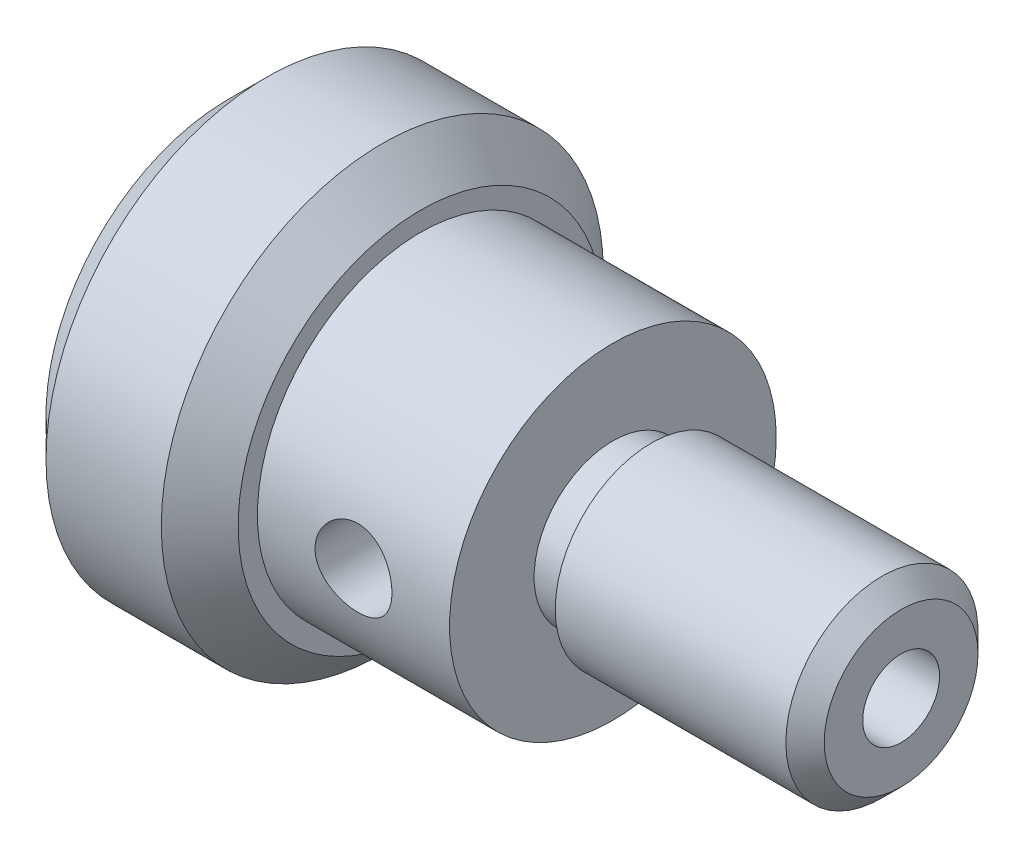
ISO-10303-21;
HEADER;
FILE_DESCRIPTION(('STEP AP214'),'2;1');
FILE_NAME('part.step','',(''),(''),'','','');
FILE_SCHEMA(('AUTOMOTIVE_DESIGN { 1 0 10303 214 1 1 1 1 }'));
ENDSEC;
DATA;
#1=APPLICATION_CONTEXT('core data for automotive mechanical design processes');
#2=APPLICATION_PROTOCOL_DEFINITION('international standard','automotive_design',2000,#1);
#3=PRODUCT_CONTEXT('',#1,'mechanical');
#4=PRODUCT('Part','Part','',(#3));
#5=PRODUCT_RELATED_PRODUCT_CATEGORY('part','',(#4));
#6=PRODUCT_DEFINITION_FORMATION('','',#4);
#7=PRODUCT_DEFINITION_CONTEXT('part definition',#1,'design');
#8=PRODUCT_DEFINITION('design','',#6,#7);
#9=PRODUCT_DEFINITION_SHAPE('','',#8);
#10=(LENGTH_UNIT() NAMED_UNIT(*) SI_UNIT(.MILLI.,.METRE.));
#11=(NAMED_UNIT(*) PLANE_ANGLE_UNIT() SI_UNIT($,.RADIAN.));
#12=(NAMED_UNIT(*) SI_UNIT($,.STERADIAN.) SOLID_ANGLE_UNIT());
#13=UNCERTAINTY_MEASURE_WITH_UNIT(LENGTH_MEASURE(1.E-05),#10,'distance_accuracy_value','');
#14=(GEOMETRIC_REPRESENTATION_CONTEXT(3) GLOBAL_UNCERTAINTY_ASSIGNED_CONTEXT((#13)) GLOBAL_UNIT_ASSIGNED_CONTEXT((#10,
#11,#12)) REPRESENTATION_CONTEXT('',''));
#15=CARTESIAN_POINT('',(0.,0.,0.));
#16=DIRECTION('',(0.,0.,1.));
#17=DIRECTION('',(1.,0.,0.));
#18=AXIS2_PLACEMENT_3D('',#15,#16,#17);
#19=CARTESIAN_POINT('',(15.,0.,-11.5));
#20=DIRECTION('',(0.,0.,1.));
#21=DIRECTION('',(1.,0.,0.));
#22=AXIS2_PLACEMENT_3D('',#19,#20,#21);
#23=CYLINDRICAL_SURFACE('',#22,2.);
#24=CARTESIAN_POINT('',(17.,0.,-8.5));
#25=CARTESIAN_POINT('',(16.9999965435594,0.110707222526124,-8.49999801750481));
#26=CARTESIAN_POINT('',(16.9907769473835,0.221454521072923,-8.49781540060716));
#27=CARTESIAN_POINT('',(16.9541891239601,0.439788787350876,-8.48931965269305));
#28=CARTESIAN_POINT('',(16.9268093098887,0.547373691572941,-8.48300388462288));
#29=CARTESIAN_POINT('',(16.8548176046271,0.756197517316249,-8.4669430800191));
#30=CARTESIAN_POINT('',(16.8102251113391,0.857443433845184,-8.45720190485864));
#31=CARTESIAN_POINT('',(16.70513893196,1.0510155369327,-8.43533444577621));
#32=CARTESIAN_POINT('',(16.6446451622497,1.14334167658186,-8.42320814931182));
#33=CARTESIAN_POINT('',(16.5082968847689,1.31815374652725,-8.39764327718341));
#34=CARTESIAN_POINT('',(16.4322053312429,1.40045211681902,-8.38418634599685));
#35=CARTESIAN_POINT('',(16.2673296337114,1.55124417062838,-8.3576023587247));
#36=CARTESIAN_POINT('',(16.1785442111942,1.61973646193728,-8.34447533602387));
#37=CARTESIAN_POINT('',(15.9893785386005,1.74182760532487,-8.31985447393301));
#38=CARTESIAN_POINT('',(15.8888627334876,1.79522157802198,-8.30838404762359));
#39=CARTESIAN_POINT('',(15.6799695603255,1.88428453492285,-8.28864082978449));
#40=CARTESIAN_POINT('',(15.5715932954807,1.91995600096022,-8.28036759056153));
#41=CARTESIAN_POINT('',(15.3521048804647,1.97193118009561,-8.2681433438507));
#42=CARTESIAN_POINT('',(15.2410762560102,1.98856967737172,-8.26411772364193));
#43=CARTESIAN_POINT('',(15.0177362036971,2.00304855484246,-8.26062082026474));
#44=CARTESIAN_POINT('',(14.9054249617393,2.00089162553843,-8.26114888525169));
#45=CARTESIAN_POINT('',(14.6852356681787,1.97810910167244,-8.26663238190337));
#46=CARTESIAN_POINT('',(14.5773141371122,1.95787749619193,-8.27149336028225));
#47=CARTESIAN_POINT('',(14.3664414887104,1.90014632726017,-8.28494503088792));
#48=CARTESIAN_POINT('',(14.263490689636,1.86264565973852,-8.29353596158136));
#49=CARTESIAN_POINT('',(14.0644006849992,1.77109260203966,-8.31356933146056));
#50=CARTESIAN_POINT('',(13.9683317607225,1.71689311623115,-8.32503693669168));
#51=CARTESIAN_POINT('',(13.7865088308527,1.59358407474821,-8.34951675356641));
#52=CARTESIAN_POINT('',(13.7007564415764,1.52447218743741,-8.36252920661224));
#53=CARTESIAN_POINT('',(13.5397377092539,1.37123756634556,-8.38903394638453));
#54=CARTESIAN_POINT('',(13.4647892544237,1.28678108396335,-8.40253007115743));
#55=CARTESIAN_POINT('',(13.3300631840312,1.10634012247957,-8.42818503228671));
#56=CARTESIAN_POINT('',(13.2702859337337,1.01035536590296,-8.4403438364415));
#57=CARTESIAN_POINT('',(13.1675011797663,0.809160897355917,-8.46200394642273));
#58=CARTESIAN_POINT('',(13.1245404467203,0.703926440039184,-8.47149782003105));
#59=CARTESIAN_POINT('',(13.057003862603,0.487457687798598,-8.48670384958574));
#60=CARTESIAN_POINT('',(13.0324249067537,0.376224409511197,-8.49241664415731));
#61=CARTESIAN_POINT('',(13.0028237974332,0.153637663571891,-8.49932407764157));
#62=CARTESIAN_POINT('',(12.9973681137337,0.042344875914933,-8.50061885597204));
#63=CARTESIAN_POINT('',(13.0049861618048,-0.179562447634433,-8.49882735084224));
#64=CARTESIAN_POINT('',(13.0180584272852,-0.290177036503304,-8.49574141406895));
#65=CARTESIAN_POINT('',(13.0620027867293,-0.506115547274071,-8.4855989282765));
#66=CARTESIAN_POINT('',(13.0926427944786,-0.61148935075237,-8.47859417913237));
#67=CARTESIAN_POINT('',(13.1705914348227,-0.815599145285604,-8.46140046160523));
#68=CARTESIAN_POINT('',(13.2179016314921,-0.914334512456049,-8.45121119444604));
#69=CARTESIAN_POINT('',(13.3287183409279,-1.10412269234789,-8.42853504656538));
#70=CARTESIAN_POINT('',(13.3924734508101,-1.19502614893552,-8.41601380204275));
#71=CARTESIAN_POINT('',(13.5340478830376,-1.36499902472578,-8.39012409804059));
#72=CARTESIAN_POINT('',(13.6118693400551,-1.44406664441852,-8.37675551017066));
#73=CARTESIAN_POINT('',(13.7813697659225,-1.58987521562228,-8.35032432460353));
#74=CARTESIAN_POINT('',(13.8733112150152,-1.65631382120375,-8.337274528673));
#75=CARTESIAN_POINT('',(14.0672985127205,-1.77281313863698,-8.31328366919846));
#76=CARTESIAN_POINT('',(14.1693439094809,-1.82287458245114,-8.30234251141978));
#77=CARTESIAN_POINT('',(14.3800851322557,-1.90483844015696,-8.28392155078471));
#78=CARTESIAN_POINT('',(14.4887377025626,-1.936847290954,-8.27642150929975));
#79=CARTESIAN_POINT('',(14.7100820330485,-1.98209519216249,-8.26570319885666));
#80=CARTESIAN_POINT('',(14.8227730237824,-1.99533779883918,-8.26248411864936));
#81=CARTESIAN_POINT('',(15.0459329676756,-2.00250786658812,-8.26074892411982));
#82=CARTESIAN_POINT('',(15.1563858107564,-1.99691656853304,-8.26211563101112));
#83=CARTESIAN_POINT('',(15.3747270360829,-1.96766652984528,-8.26912996315445));
#84=CARTESIAN_POINT('',(15.4826154589317,-1.94400807547166,-8.27477752057995));
#85=CARTESIAN_POINT('',(15.6923105225665,-1.87954382970523,-8.28965579164934));
#86=CARTESIAN_POINT('',(15.794143175447,-1.83881850605662,-8.29886967522321));
#87=CARTESIAN_POINT('',(15.9895982133633,-1.74144219098134,-8.31984668167287));
#88=CARTESIAN_POINT('',(16.0832195911107,-1.68478924926668,-8.33161011669299));
#89=CARTESIAN_POINT('',(16.2619430585988,-1.55561482360098,-8.35670265527952));
#90=CARTESIAN_POINT('',(16.3467964038323,-1.4827549558821,-8.37006180674132));
#91=CARTESIAN_POINT('',(16.5032293540248,-1.32390732881552,-8.3966506561662));
#92=CARTESIAN_POINT('',(16.5748058508324,-1.23791650403864,-8.40988032313166));
#93=CARTESIAN_POINT('',(16.7037289322992,-1.05363595816287,-8.43496426083158));
#94=CARTESIAN_POINT('',(16.7608371450185,-0.95517590519952,-8.44679396805159));
#95=CARTESIAN_POINT('',(16.8576008466621,-0.749789351513638,-8.4674927014593));
#96=CARTESIAN_POINT('',(16.8972698926713,-0.642869503952002,-8.47636402617268));
#97=CARTESIAN_POINT('',(16.9515603730731,-0.446656582230613,-8.48870155772743));
#98=CARTESIAN_POINT('',(16.9696882671158,-0.358363661577137,-8.49291078599891));
#99=CARTESIAN_POINT('',(16.9939091322044,-0.180055929660539,-8.49856073191377));
#100=CARTESIAN_POINT('',(17.0000028112179,-0.0900412200041045,-8.5000016124177));
#101=CARTESIAN_POINT('',(17.,0.,-8.5));
#102=B_SPLINE_CURVE_WITH_KNOTS('',3,(#24,#25,#26,#27,#28,#29,#30,#31,#32,#33,#34,#35,#36,#37,
#38,#39,#40,#41,#42,#43,#44,#45,#46,#47,#48,#49,#50,#51,#52,#53,#54,#55,#56,#57,#58,#59,#60,#61,
#62,#63,#64,#65,#66,#67,#68,#69,#70,#71,#72,#73,#74,#75,#76,#77,#78,#79,#80,#81,#82,#83,#84,#85,
#86,#87,#88,#89,#90,#91,#92,#93,#94,#95,#96,#97,#98,#99,#100,#101),.UNSPECIFIED.,.T.,.F.,(4,2,2,
2,2,2,2,2,2,2,2,2,2,2,2,2,2,2,2,2,2,2,2,2,2,2,2,2,2,2,2,2,2,2,2,2,2,2,4),(0.,0.331791888568959,
0.663795675313148,0.995426396224179,1.32705886109823,1.66416482514813,2.00130476606585,
2.34282124715151,2.68428988928473,3.01965509679603,3.35497229870821,3.68315396602227,
4.0113566180301,4.34253723635987,4.67376967418079,5.0133309031367,5.35290030665979,
5.69340753264886,6.03385723219515,6.36653706536538,6.69919057193507,7.02754747309658,
7.35593519043891,7.68961218148233,8.02333985305755,8.36425908086049,8.70516306950514,
9.04403551593491,9.3828437363253,9.71306113426889,10.0432733003012,10.3719457765065,
10.7006585151894,11.0370154300388,11.3734509879818,11.7151138135869,12.0565105612022,
12.3263818797879,12.5962373214883),.UNSPECIFIED.);
#103=CARTESIAN_POINT('',(17.,0.,-8.5));
#104=VERTEX_POINT('',#103);
#105=EDGE_CURVE('E85',#104,#104,#102,.T.);
#106=ORIENTED_EDGE('',*,*,#105,.F.);
#107=EDGE_LOOP('',(#106));
#108=FACE_BOUND('',#107,.T.);
#109=CARTESIAN_POINT('',(15.,0.,0.));
#110=DIRECTION('',(-0.707106781186547,0.,0.707106781186548));
#111=DIRECTION('',(0.707106781186547,0.,0.707106781186548));
#112=AXIS2_PLACEMENT_3D('',#109,#110,#111);
#113=ELLIPSE('',#112,2.82842712474619,2.);
#114=CARTESIAN_POINT('',(15.,-2.,0.));
#115=VERTEX_POINT('',#114);
#116=CARTESIAN_POINT('',(15.,2.,0.));
#117=VERTEX_POINT('',#116);
#118=EDGE_CURVE('E11',#115,#117,#113,.F.);
#119=ORIENTED_EDGE('',*,*,#118,.F.);
#120=CARTESIAN_POINT('',(15.,0.,0.));
#121=DIRECTION('',(0.707106781186547,0.,0.707106781186548));
#122=DIRECTION('',(-0.707106781186547,0.,0.707106781186548));
#123=AXIS2_PLACEMENT_3D('',#120,#121,#122);
#124=ELLIPSE('',#123,2.82842712474619,2.);
#125=EDGE_CURVE('E60',#117,#115,#124,.F.);
#126=ORIENTED_EDGE('',*,*,#125,.F.);
#127=EDGE_LOOP('',(#119,#126));
#128=FACE_BOUND('',#127,.T.);
#129=ADVANCED_FACE('F45',(#108,#128),#23,.F.);
#130=CARTESIAN_POINT('',(17.,0.,8.5));
#131=CARTESIAN_POINT('',(16.9999965435594,-0.110707222526124,8.49999801750481));
#132=CARTESIAN_POINT('',(16.9907769473835,-0.221454521072923,8.49781540060716));
#133=CARTESIAN_POINT('',(16.9541891239601,-0.439788787350876,8.48931965269305));
#134=CARTESIAN_POINT('',(16.9268093098887,-0.547373691572941,8.48300388462288));
#135=CARTESIAN_POINT('',(16.8548176046271,-0.756197517316249,8.4669430800191));
#136=CARTESIAN_POINT('',(16.8102251113391,-0.857443433845184,8.45720190485864));
#137=CARTESIAN_POINT('',(16.70513893196,-1.0510155369327,8.43533444577621));
#138=CARTESIAN_POINT('',(16.6446451622497,-1.14334167658186,8.42320814931182));
#139=CARTESIAN_POINT('',(16.5082968847689,-1.31815374652725,8.39764327718341));
#140=CARTESIAN_POINT('',(16.4322053312429,-1.40045211681902,8.38418634599685));
#141=CARTESIAN_POINT('',(16.2673296337114,-1.55124417062838,8.3576023587247));
#142=CARTESIAN_POINT('',(16.1785442111942,-1.61973646193728,8.34447533602387));
#143=CARTESIAN_POINT('',(15.9893785386005,-1.74182760532487,8.31985447393301));
#144=CARTESIAN_POINT('',(15.8888627334876,-1.79522157802198,8.30838404762359));
#145=CARTESIAN_POINT('',(15.6799695603255,-1.88428453492285,8.28864082978449));
#146=CARTESIAN_POINT('',(15.5715932954807,-1.91995600096022,8.28036759056153));
#147=CARTESIAN_POINT('',(15.3521048804647,-1.97193118009561,8.2681433438507));
#148=CARTESIAN_POINT('',(15.2410762560102,-1.98856967737172,8.26411772364193));
#149=CARTESIAN_POINT('',(15.0177362036971,-2.00304855484246,8.26062082026474));
#150=CARTESIAN_POINT('',(14.9054249617393,-2.00089162553843,8.26114888525169));
#151=CARTESIAN_POINT('',(14.6852356681787,-1.97810910167244,8.26663238190337));
#152=CARTESIAN_POINT('',(14.5773141371122,-1.95787749619193,8.27149336028225));
#153=CARTESIAN_POINT('',(14.3664414887104,-1.90014632726017,8.28494503088792));
#154=CARTESIAN_POINT('',(14.263490689636,-1.86264565973852,8.29353596158136));
#155=CARTESIAN_POINT('',(14.0644006849992,-1.77109260203966,8.31356933146056));
#156=CARTESIAN_POINT('',(13.9683317607225,-1.71689311623115,8.32503693669168));
#157=CARTESIAN_POINT('',(13.7865088308527,-1.59358407474821,8.34951675356641));
#158=CARTESIAN_POINT('',(13.7007564415764,-1.52447218743741,8.36252920661224));
#159=CARTESIAN_POINT('',(13.5397377092539,-1.37123756634556,8.38903394638453));
#160=CARTESIAN_POINT('',(13.4647892544237,-1.28678108396335,8.40253007115743));
#161=CARTESIAN_POINT('',(13.3300631840312,-1.10634012247957,8.42818503228671));
#162=CARTESIAN_POINT('',(13.2702859337337,-1.01035536590296,8.4403438364415));
#163=CARTESIAN_POINT('',(13.1675011797663,-0.809160897355917,8.46200394642273));
#164=CARTESIAN_POINT('',(13.1245404467203,-0.703926440039184,8.47149782003105));
#165=CARTESIAN_POINT('',(13.057003862603,-0.487457687798598,8.48670384958574));
#166=CARTESIAN_POINT('',(13.0324249067537,-0.376224409511197,8.49241664415731));
#167=CARTESIAN_POINT('',(13.0028237974332,-0.153637663571891,8.49932407764157));
#168=CARTESIAN_POINT('',(12.9973681137337,-0.042344875914933,8.50061885597204));
#169=CARTESIAN_POINT('',(13.0049861618048,0.179562447634433,8.49882735084224));
#170=CARTESIAN_POINT('',(13.0180584272852,0.290177036503304,8.49574141406895));
#171=CARTESIAN_POINT('',(13.0620027867293,0.506115547274071,8.4855989282765));
#172=CARTESIAN_POINT('',(13.0926427944786,0.61148935075237,8.47859417913237));
#173=CARTESIAN_POINT('',(13.1705914348227,0.815599145285604,8.46140046160523));
#174=CARTESIAN_POINT('',(13.2179016314921,0.914334512456049,8.45121119444604));
#175=CARTESIAN_POINT('',(13.3287183409279,1.10412269234789,8.42853504656538));
#176=CARTESIAN_POINT('',(13.3924734508101,1.19502614893552,8.41601380204275));
#177=CARTESIAN_POINT('',(13.5340478830376,1.36499902472578,8.39012409804059));
#178=CARTESIAN_POINT('',(13.6118693400551,1.44406664441852,8.37675551017066));
#179=CARTESIAN_POINT('',(13.7813697659225,1.58987521562228,8.35032432460353));
#180=CARTESIAN_POINT('',(13.8733112150152,1.65631382120375,8.337274528673));
#181=CARTESIAN_POINT('',(14.0672985127205,1.77281313863698,8.31328366919846));
#182=CARTESIAN_POINT('',(14.1693439094809,1.82287458245114,8.30234251141978));
#183=CARTESIAN_POINT('',(14.3800851322557,1.90483844015696,8.28392155078471));
#184=CARTESIAN_POINT('',(14.4887377025626,1.936847290954,8.27642150929975));
#185=CARTESIAN_POINT('',(14.7100820330485,1.98209519216249,8.26570319885666));
#186=CARTESIAN_POINT('',(14.8227730237824,1.99533779883918,8.26248411864936));
#187=CARTESIAN_POINT('',(15.0459329676756,2.00250786658812,8.26074892411982));
#188=CARTESIAN_POINT('',(15.1563858107564,1.99691656853304,8.26211563101112));
#189=CARTESIAN_POINT('',(15.3747270360829,1.96766652984528,8.26912996315445));
#190=CARTESIAN_POINT('',(15.4826154589317,1.94400807547166,8.27477752057995));
#191=CARTESIAN_POINT('',(15.6923105225665,1.87954382970523,8.28965579164934));
#192=CARTESIAN_POINT('',(15.794143175447,1.83881850605662,8.29886967522321));
#193=CARTESIAN_POINT('',(15.9895982133633,1.74144219098134,8.31984668167287));
#194=CARTESIAN_POINT('',(16.0832195911107,1.68478924926668,8.33161011669299));
#195=CARTESIAN_POINT('',(16.2619430585988,1.55561482360098,8.35670265527952));
#196=CARTESIAN_POINT('',(16.3467964038323,1.4827549558821,8.37006180674132));
#197=CARTESIAN_POINT('',(16.5032293540248,1.32390732881552,8.3966506561662));
#198=CARTESIAN_POINT('',(16.5748058508324,1.23791650403864,8.40988032313166));
#199=CARTESIAN_POINT('',(16.7037289322992,1.05363595816287,8.43496426083158));
#200=CARTESIAN_POINT('',(16.7608371450185,0.95517590519952,8.44679396805159));
#201=CARTESIAN_POINT('',(16.8576008466621,0.749789351513638,8.4674927014593));
#202=CARTESIAN_POINT('',(16.8972698926713,0.642869503952002,8.47636402617268));
#203=CARTESIAN_POINT('',(16.9515603730731,0.446656582230613,8.48870155772743));
#204=CARTESIAN_POINT('',(16.9696882671158,0.358363661577137,8.49291078599891));
#205=CARTESIAN_POINT('',(16.9939091322044,0.180055929660539,8.49856073191377));
#206=CARTESIAN_POINT('',(17.0000028112179,0.0900412200041045,8.5000016124177));
#207=CARTESIAN_POINT('',(17.,0.,8.5));
#208=B_SPLINE_CURVE_WITH_KNOTS('',3,(#130,#131,#132,#133,#134,#135,#136,#137,#138,#139,#140,
#141,#142,#143,#144,#145,#146,#147,#148,#149,#150,#151,#152,#153,#154,#155,#156,#157,#158,#159,
#160,#161,#162,#163,#164,#165,#166,#167,#168,#169,#170,#171,#172,#173,#174,#175,#176,#177,#178,
#179,#180,#181,#182,#183,#184,#185,#186,#187,#188,#189,#190,#191,#192,#193,#194,#195,#196,#197,
#198,#199,#200,#201,#202,#203,#204,#205,#206,#207),.UNSPECIFIED.,.T.,.F.,(4,2,2,2,2,2,2,2,2,2,2,
2,2,2,2,2,2,2,2,2,2,2,2,2,2,2,2,2,2,2,2,2,2,2,2,2,2,2,4),(0.,0.331791888568959,
0.663795675313148,0.995426396224179,1.32705886109823,1.66416482514813,2.00130476606585,
2.34282124715151,2.68428988928473,3.01965509679603,3.35497229870821,3.68315396602227,
4.0113566180301,4.34253723635987,4.67376967418079,5.0133309031367,5.35290030665979,
5.69340753264886,6.03385723219515,6.36653706536538,6.69919057193507,7.02754747309658,
7.35593519043891,7.68961218148233,8.02333985305755,8.36425908086049,8.70516306950514,
9.04403551593491,9.3828437363253,9.71306113426889,10.0432733003012,10.3719457765065,
10.7006585151894,11.0370154300388,11.3734509879818,11.7151138135869,12.0565105612022,
12.3263818797879,12.5962373214883),.UNSPECIFIED.);
#209=CARTESIAN_POINT('',(17.,0.,8.5));
#210=VERTEX_POINT('',#209);
#211=EDGE_CURVE('E76',#210,#210,#208,.T.);
#212=ORIENTED_EDGE('',*,*,#211,.F.);
#213=EDGE_LOOP('',(#212));
#214=FACE_BOUND('',#213,.T.);
#215=CARTESIAN_POINT('',(15.,0.,0.));
#216=DIRECTION('',(-0.707106781186547,0.,0.707106781186548));
#217=DIRECTION('',(0.707106781186547,0.,0.707106781186548));
#218=AXIS2_PLACEMENT_3D('',#215,#216,#217);
#219=ELLIPSE('',#218,2.82842712474619,2.);
#220=EDGE_CURVE('E54',#115,#117,#219,.T.);
#221=ORIENTED_EDGE('',*,*,#220,.F.);
#222=CARTESIAN_POINT('',(15.,0.,0.));
#223=DIRECTION('',(0.707106781186547,0.,0.707106781186548));
#224=DIRECTION('',(-0.707106781186547,0.,0.707106781186548));
#225=AXIS2_PLACEMENT_3D('',#222,#223,#224);
#226=ELLIPSE('',#225,2.82842712474619,2.);
#227=EDGE_CURVE('E65',#117,#115,#226,.T.);
#228=ORIENTED_EDGE('',*,*,#227,.F.);
#229=EDGE_LOOP('',(#221,#228));
#230=FACE_BOUND('',#229,.T.);
#231=ADVANCED_FACE('F74',(#214,#230),#23,.F.);
#232=CARTESIAN_POINT('',(10.,0.,0.));
#233=DIRECTION('',(-1.,0.,0.));
#234=DIRECTION('',(0.,0.,1.));
#235=AXIS2_PLACEMENT_3D('',#232,#233,#234);
#236=CYLINDRICAL_SURFACE('',#235,11.5);
#237=CARTESIAN_POINT('',(7.99999999999999,0.,0.));
#238=DIRECTION('',(1.,0.,0.));
#239=DIRECTION('',(0.,0.,-1.));
#240=AXIS2_PLACEMENT_3D('',#237,#238,#239);
#241=CIRCLE('',#240,11.5);
#242=CARTESIAN_POINT('',(7.99999999999999,0.,-11.5));
#243=VERTEX_POINT('',#242);
#244=EDGE_CURVE('E145',#243,#243,#241,.F.);
#245=ORIENTED_EDGE('',*,*,#244,.T.);
#246=EDGE_LOOP('',(#245));
#247=FACE_BOUND('',#246,.T.);
#248=CARTESIAN_POINT('',(2.,0.,0.));
#249=DIRECTION('',(1.,0.,0.));
#250=DIRECTION('',(0.,0.,-1.));
#251=AXIS2_PLACEMENT_3D('',#248,#249,#250);
#252=CIRCLE('',#251,11.5);
#253=CARTESIAN_POINT('',(2.,0.,-11.5));
#254=VERTEX_POINT('',#253);
#255=EDGE_CURVE('E133',#254,#254,#252,.T.);
#256=ORIENTED_EDGE('',*,*,#255,.T.);
#257=EDGE_LOOP('',(#256));
#258=FACE_BOUND('',#257,.T.);
#259=ADVANCED_FACE('F213',(#247,#258),#236,.T.);
#260=CARTESIAN_POINT('',(10.,0.,0.));
#261=DIRECTION('',(1.,0.,0.));
#262=DIRECTION('',(0.,0.,-1.));
#263=AXIS2_PLACEMENT_3D('',#260,#261,#262);
#264=PLANE('',#263);
#265=CARTESIAN_POINT('',(10.,0.,0.));
#266=DIRECTION('',(1.,0.,0.));
#267=DIRECTION('',(0.,0.,-1.));
#268=AXIS2_PLACEMENT_3D('',#265,#266,#267);
#269=CIRCLE('',#268,8.5);
#270=CARTESIAN_POINT('',(10.,0.,-8.5));
#271=VERTEX_POINT('',#270);
#272=EDGE_CURVE('E143',#271,#271,#269,.T.);
#273=ORIENTED_EDGE('',*,*,#272,.F.);
#274=EDGE_LOOP('',(#273));
#275=FACE_BOUND('',#274,.T.);
#276=CARTESIAN_POINT('',(10.,0.,0.));
#277=DIRECTION('',(1.,0.,0.));
#278=DIRECTION('',(0.,0.,-1.));
#279=AXIS2_PLACEMENT_3D('',#276,#277,#278);
#280=CIRCLE('',#279,9.50000000000001);
#281=CARTESIAN_POINT('',(10.,0.,-9.50000000000001));
#282=VERTEX_POINT('',#281);
#283=EDGE_CURVE('E149',#282,#282,#280,.T.);
#284=ORIENTED_EDGE('',*,*,#283,.T.);
#285=EDGE_LOOP('',(#284));
#286=FACE_BOUND('',#285,.T.);
#287=ADVANCED_FACE('F282',(#275,#286),#264,.T.);
#288=CARTESIAN_POINT('',(0.,0.,0.));
#289=DIRECTION('',(1.,0.,0.));
#290=DIRECTION('',(0.,0.,-1.));
#291=AXIS2_PLACEMENT_3D('',#288,#289,#290);
#292=PLANE('',#291);
#293=CARTESIAN_POINT('',(0.,0.,0.));
#294=DIRECTION('',(1.,0.,0.));
#295=DIRECTION('',(0.,0.,-1.));
#296=AXIS2_PLACEMENT_3D('',#293,#294,#295);
#297=CIRCLE('',#296,9.49999999999999);
#298=CARTESIAN_POINT('',(0.,0.,-9.49999999999999));
#299=VERTEX_POINT('',#298);
#300=EDGE_CURVE('E137',#299,#299,#297,.F.);
#301=ORIENTED_EDGE('',*,*,#300,.T.);
#302=EDGE_LOOP('',(#301));
#303=FACE_BOUND('',#302,.T.);
#304=ADVANCED_FACE('F272',(#303),#292,.F.);
#305=CARTESIAN_POINT('',(2.,0.,0.));
#306=DIRECTION('',(1.,0.,0.));
#307=DIRECTION('',(0.,0.,-1.));
#308=AXIS2_PLACEMENT_3D('',#305,#306,#307);
#309=CONICAL_SURFACE('',#308,11.5,0.785398163397452);
#310=ORIENTED_EDGE('',*,*,#300,.F.);
#311=EDGE_LOOP('',(#310));
#312=FACE_BOUND('',#311,.T.);
#313=ORIENTED_EDGE('',*,*,#255,.F.);
#314=EDGE_LOOP('',(#313));
#315=FACE_BOUND('',#314,.T.);
#316=ADVANCED_FACE('F261',(#312,#315),#309,.T.);
#317=CARTESIAN_POINT('',(10.,0.,0.));
#318=DIRECTION('',(-1.,0.,0.));
#319=DIRECTION('',(0.,0.,1.));
#320=AXIS2_PLACEMENT_3D('',#317,#318,#319);
#321=CONICAL_SURFACE('',#320,9.50000000000001,0.785398163397444);
#322=ORIENTED_EDGE('',*,*,#244,.F.);
#323=EDGE_LOOP('',(#322));
#324=FACE_BOUND('',#323,.T.);
#325=ORIENTED_EDGE('',*,*,#283,.F.);
#326=EDGE_LOOP('',(#325));
#327=FACE_BOUND('',#326,.T.);
#328=ADVANCED_FACE('F123',(#324,#327),#321,.T.);
#329=CARTESIAN_POINT('',(20.,0.,0.));
#330=DIRECTION('',(-1.,0.,0.));
#331=DIRECTION('',(0.,0.,1.));
#332=AXIS2_PLACEMENT_3D('',#329,#330,#331);
#333=CYLINDRICAL_SURFACE('',#332,8.5);
#334=ORIENTED_EDGE('',*,*,#211,.T.);
#335=EDGE_LOOP('',(#334));
#336=FACE_BOUND('',#335,.T.);
#337=ORIENTED_EDGE('',*,*,#105,.T.);
#338=EDGE_LOOP('',(#337));
#339=FACE_BOUND('',#338,.T.);
#340=CARTESIAN_POINT('',(20.,0.,0.));
#341=DIRECTION('',(1.,0.,0.));
#342=DIRECTION('',(0.,0.,-1.));
#343=AXIS2_PLACEMENT_3D('',#340,#341,#342);
#344=CIRCLE('',#343,8.5);
#345=CARTESIAN_POINT('',(20.,0.,-8.5));
#346=VERTEX_POINT('',#345);
#347=EDGE_CURVE('E131',#346,#346,#344,.T.);
#348=ORIENTED_EDGE('',*,*,#347,.F.);
#349=EDGE_LOOP('',(#348));
#350=FACE_BOUND('',#349,.T.);
#351=ORIENTED_EDGE('',*,*,#272,.T.);
#352=EDGE_LOOP('',(#351));
#353=FACE_BOUND('',#352,.T.);
#354=ADVANCED_FACE('F90',(#336,#339,#350,#353),#333,.T.);
#355=CARTESIAN_POINT('',(20.,0.,0.));
#356=DIRECTION('',(1.,0.,0.));
#357=DIRECTION('',(0.,0.,-1.));
#358=AXIS2_PLACEMENT_3D('',#355,#356,#357);
#359=PLANE('',#358);
#360=CARTESIAN_POINT('',(20.,0.,0.));
#361=DIRECTION('',(1.,0.,0.));
#362=DIRECTION('',(0.,0.,-1.));
#363=AXIS2_PLACEMENT_3D('',#360,#361,#362);
#364=CIRCLE('',#363,4.1);
#365=CARTESIAN_POINT('',(20.,0.,-4.1));
#366=VERTEX_POINT('',#365);
#367=EDGE_CURVE('E128',#366,#366,#364,.T.);
#368=ORIENTED_EDGE('',*,*,#367,.F.);
#369=EDGE_LOOP('',(#368));
#370=FACE_BOUND('',#369,.T.);
#371=ORIENTED_EDGE('',*,*,#347,.T.);
#372=EDGE_LOOP('',(#371));
#373=FACE_BOUND('',#372,.T.);
#374=ADVANCED_FACE('F115',(#370,#373),#359,.T.);
#375=CARTESIAN_POINT('',(22.,0.,0.));
#376=DIRECTION('',(-1.,0.,0.));
#377=DIRECTION('',(0.,0.,1.));
#378=AXIS2_PLACEMENT_3D('',#375,#376,#377);
#379=CYLINDRICAL_SURFACE('',#378,4.1);
#380=CARTESIAN_POINT('',(22.,0.,0.));
#381=DIRECTION('',(1.,0.,0.));
#382=DIRECTION('',(0.,0.,-1.));
#383=AXIS2_PLACEMENT_3D('',#380,#381,#382);
#384=CIRCLE('',#383,4.1);
#385=CARTESIAN_POINT('',(22.,0.,-4.1));
#386=VERTEX_POINT('',#385);
#387=EDGE_CURVE('E134',#386,#386,#384,.T.);
#388=ORIENTED_EDGE('',*,*,#387,.F.);
#389=EDGE_LOOP('',(#388));
#390=FACE_BOUND('',#389,.T.);
#391=ORIENTED_EDGE('',*,*,#367,.T.);
#392=EDGE_LOOP('',(#391));
#393=FACE_BOUND('',#392,.T.);
#394=ADVANCED_FACE('F112',(#390,#393),#379,.T.);
#395=CARTESIAN_POINT('',(35.,0.,0.));
#396=DIRECTION('',(-1.,0.,0.));
#397=DIRECTION('',(0.,0.,1.));
#398=AXIS2_PLACEMENT_3D('',#395,#396,#397);
#399=CYLINDRICAL_SURFACE('',#398,5.);
#400=CARTESIAN_POINT('',(34.,0.,0.));
#401=DIRECTION('',(1.,0.,0.));
#402=DIRECTION('',(0.,0.,-1.));
#403=AXIS2_PLACEMENT_3D('',#400,#401,#402);
#404=CIRCLE('',#403,5.);
#405=CARTESIAN_POINT('',(34.,0.,5.));
#406=VERTEX_POINT('',#405);
#407=EDGE_CURVE('E72',#406,#406,#404,.F.);
#408=CARTESIAN_POINT('',(22.,0.,0.));
#409=DIRECTION('',(1.,0.,0.));
#410=DIRECTION('',(0.,0.,-1.));
#411=AXIS2_PLACEMENT_3D('',#408,#409,#410);
#412=CIRCLE('',#411,5.);
#413=CARTESIAN_POINT('',(22.,0.,5.));
#414=VERTEX_POINT('',#413);
#415=EDGE_CURVE('E84',#414,#414,#412,.T.);
#416=CARTESIAN_POINT('',(34.,0.,5.));
#417=CARTESIAN_POINT('',(33.875,0.,5.));
#418=CARTESIAN_POINT('',(33.75,0.,5.));
#419=CARTESIAN_POINT('',(33.5,0.,5.));
#420=CARTESIAN_POINT('',(33.375,0.,5.));
#421=CARTESIAN_POINT('',(33.125,0.,5.));
#422=CARTESIAN_POINT('',(33.,0.,5.));
#423=CARTESIAN_POINT('',(32.75,0.,5.));
#424=CARTESIAN_POINT('',(32.625,0.,5.));
#425=CARTESIAN_POINT('',(32.375,0.,5.));
#426=CARTESIAN_POINT('',(32.25,0.,5.));
#427=CARTESIAN_POINT('',(32.,0.,5.));
#428=CARTESIAN_POINT('',(31.875,0.,5.));
#429=CARTESIAN_POINT('',(31.625,0.,5.));
#430=CARTESIAN_POINT('',(31.5,0.,5.));
#431=CARTESIAN_POINT('',(31.25,0.,5.));
#432=CARTESIAN_POINT('',(31.125,0.,5.));
#433=CARTESIAN_POINT('',(30.875,0.,5.));
#434=CARTESIAN_POINT('',(30.75,0.,5.));
#435=CARTESIAN_POINT('',(30.5,0.,5.));
#436=CARTESIAN_POINT('',(30.375,0.,5.));
#437=CARTESIAN_POINT('',(30.125,0.,5.));
#438=CARTESIAN_POINT('',(30.,0.,5.));
#439=CARTESIAN_POINT('',(29.75,0.,5.));
#440=CARTESIAN_POINT('',(29.625,0.,5.));
#441=CARTESIAN_POINT('',(29.375,0.,5.));
#442=CARTESIAN_POINT('',(29.25,0.,5.));
#443=CARTESIAN_POINT('',(29.,0.,5.));
#444=CARTESIAN_POINT('',(28.875,0.,5.));
#445=CARTESIAN_POINT('',(28.625,0.,5.));
#446=CARTESIAN_POINT('',(28.5,0.,5.));
#447=CARTESIAN_POINT('',(28.25,0.,5.));
#448=CARTESIAN_POINT('',(28.125,0.,5.));
#449=CARTESIAN_POINT('',(27.875,0.,5.));
#450=CARTESIAN_POINT('',(27.75,0.,5.));
#451=CARTESIAN_POINT('',(27.5,0.,5.));
#452=CARTESIAN_POINT('',(27.375,0.,5.));
#453=CARTESIAN_POINT('',(27.125,0.,5.));
#454=CARTESIAN_POINT('',(27.,0.,5.));
#455=CARTESIAN_POINT('',(26.75,0.,5.));
#456=CARTESIAN_POINT('',(26.625,0.,5.));
#457=CARTESIAN_POINT('',(26.375,0.,5.));
#458=CARTESIAN_POINT('',(26.25,0.,5.));
#459=CARTESIAN_POINT('',(26.,0.,5.));
#460=CARTESIAN_POINT('',(25.875,0.,5.));
#461=CARTESIAN_POINT('',(25.625,0.,5.));
#462=CARTESIAN_POINT('',(25.5,0.,5.));
#463=CARTESIAN_POINT('',(25.25,0.,5.));
#464=CARTESIAN_POINT('',(25.125,0.,5.));
#465=CARTESIAN_POINT('',(24.875,0.,5.));
#466=CARTESIAN_POINT('',(24.75,0.,5.));
#467=CARTESIAN_POINT('',(24.5,0.,5.));
#468=CARTESIAN_POINT('',(24.375,0.,5.));
#469=CARTESIAN_POINT('',(24.125,0.,5.));
#470=CARTESIAN_POINT('',(24.,0.,5.));
#471=CARTESIAN_POINT('',(23.75,0.,5.));
#472=CARTESIAN_POINT('',(23.625,0.,5.));
#473=CARTESIAN_POINT('',(23.375,0.,5.));
#474=CARTESIAN_POINT('',(23.25,0.,5.));
#475=CARTESIAN_POINT('',(23.,0.,5.));
#476=CARTESIAN_POINT('',(22.875,0.,5.));
#477=CARTESIAN_POINT('',(22.625,0.,5.));
#478=CARTESIAN_POINT('',(22.5,0.,5.));
#479=CARTESIAN_POINT('',(22.25,0.,5.));
#480=CARTESIAN_POINT('',(22.125,0.,5.));
#481=CARTESIAN_POINT('',(22.,0.,5.));
#482=B_SPLINE_CURVE_WITH_KNOTS('',3,(#416,#417,#418,#419,#420,#421,#422,#423,#424,#425,#426,
#427,#428,#429,#430,#431,#432,#433,#434,#435,#436,#437,#438,#439,#440,#441,#442,#443,#444,#445,
#446,#447,#448,#449,#450,#451,#452,#453,#454,#455,#456,#457,#458,#459,#460,#461,#462,#463,#464,
#465,#466,#467,#468,#469,#470,#471,#472,#473,#474,#475,#476,#477,#478,#479,#480,#481),
.UNSPECIFIED.,.F.,.F.,(4,2,2,2,2,2,2,2,2,2,2,2,2,2,2,2,2,2,2,2,2,2,2,2,2,2,2,2,2,2,2,2,4),(0.,
0.375,0.750000000000001,1.125,1.5,1.875,2.25,2.625,3.,3.375,3.75,4.125,4.5,4.875,5.25,
5.62500000000001,6.00000000000001,6.37500000000001,6.75000000000001,7.12500000000001,
7.50000000000001,7.87500000000001,8.25000000000001,8.62500000000001,9.00000000000001,
9.37500000000001,9.75000000000001,10.125,10.5,10.875,11.25,11.625,12.),.UNSPECIFIED.);
#483=EDGE_CURVE('BSEAM105',#406,#414,#482,.T.);
#484=ORIENTED_EDGE('',*,*,#407,.T.);
#485=ORIENTED_EDGE('',*,*,#415,.T.);
#486=ORIENTED_EDGE('',*,*,#483,.T.);
#487=ORIENTED_EDGE('',*,*,#483,.F.);
#488=EDGE_LOOP('',(#484,#486,#485,#487));
#489=FACE_BOUND('',#488,.T.);
#490=ADVANCED_FACE('F105',(#489),#399,.T.);
#491=CARTESIAN_POINT('',(35.,0.,0.));
#492=DIRECTION('',(1.,0.,0.));
#493=DIRECTION('',(0.,0.,-1.));
#494=AXIS2_PLACEMENT_3D('',#491,#492,#493);
#495=PLANE('',#494);
#496=CARTESIAN_POINT('',(35.,0.,0.));
#497=DIRECTION('',(1.,0.,0.));
#498=DIRECTION('',(0.,0.,-1.));
#499=AXIS2_PLACEMENT_3D('',#496,#497,#498);
#500=CIRCLE('',#499,2.);
#501=CARTESIAN_POINT('',(35.,0.,-2.));
#502=VERTEX_POINT('',#501);
#503=EDGE_CURVE('E175',#502,#502,#500,.F.);
#504=ORIENTED_EDGE('',*,*,#503,.T.);
#505=EDGE_LOOP('',(#504));
#506=FACE_BOUND('',#505,.T.);
#507=CARTESIAN_POINT('',(35.,0.,0.));
#508=DIRECTION('',(1.,0.,0.));
#509=DIRECTION('',(0.,0.,-1.));
#510=AXIS2_PLACEMENT_3D('',#507,#508,#509);
#511=CIRCLE('',#510,4.00000000000002);
#512=CARTESIAN_POINT('',(35.,0.,-4.00000000000002));
#513=VERTEX_POINT('',#512);
#514=EDGE_CURVE('E154',#513,#513,#511,.T.);
#515=ORIENTED_EDGE('',*,*,#514,.T.);
#516=EDGE_LOOP('',(#515));
#517=FACE_BOUND('',#516,.T.);
#518=ADVANCED_FACE('F100',(#506,#517),#495,.T.);
#519=CARTESIAN_POINT('',(22.,0.,0.));
#520=DIRECTION('',(1.,0.,0.));
#521=DIRECTION('',(0.,0.,-1.));
#522=AXIS2_PLACEMENT_3D('',#519,#520,#521);
#523=PLANE('',#522);
#524=ORIENTED_EDGE('',*,*,#387,.T.);
#525=EDGE_LOOP('',(#524));
#526=FACE_BOUND('',#525,.T.);
#527=ORIENTED_EDGE('',*,*,#415,.F.);
#528=EDGE_LOOP('',(#527));
#529=FACE_BOUND('',#528,.T.);
#530=ADVANCED_FACE('F104',(#526,#529),#523,.F.);
#531=CARTESIAN_POINT('',(35.,0.,0.));
#532=DIRECTION('',(-1.,0.,0.));
#533=DIRECTION('',(0.,0.,1.));
#534=AXIS2_PLACEMENT_3D('',#531,#532,#533);
#535=CONICAL_SURFACE('',#534,4.00000000000002,0.785398163397447);
#536=ORIENTED_EDGE('',*,*,#407,.F.);
#537=EDGE_LOOP('',(#536));
#538=FACE_BOUND('',#537,.T.);
#539=ORIENTED_EDGE('',*,*,#514,.F.);
#540=EDGE_LOOP('',(#539));
#541=FACE_BOUND('',#540,.T.);
#542=ADVANCED_FACE('F48',(#538,#541),#535,.T.);
#543=CARTESIAN_POINT('',(35.000012,0.,0.));
#544=DIRECTION('',(-1.,0.,0.));
#545=DIRECTION('',(0.,0.,1.));
#546=AXIS2_PLACEMENT_3D('',#543,#544,#545);
#547=CYLINDRICAL_SURFACE('',#546,2.);
#548=ORIENTED_EDGE('',*,*,#503,.F.);
#549=EDGE_LOOP('',(#548));
#550=FACE_BOUND('',#549,.T.);
#551=ORIENTED_EDGE('',*,*,#220,.T.);
#552=ORIENTED_EDGE('',*,*,#125,.T.);
#553=EDGE_LOOP('',(#551,#552));
#554=FACE_BOUND('',#553,.T.);
#555=ADVANCED_FACE('F71',(#550,#554),#547,.F.);
#556=CARTESIAN_POINT('',(12.,0.,0.));
#557=DIRECTION('',(1.,0.,0.));
#558=DIRECTION('',(0.,0.,-1.));
#559=AXIS2_PLACEMENT_3D('',#556,#557,#558);
#560=CIRCLE('',#559,2.);
#561=CARTESIAN_POINT('',(12.,0.,-2.));
#562=VERTEX_POINT('',#561);
#563=EDGE_CURVE('E176',#562,#562,#560,.T.);
#564=ORIENTED_EDGE('',*,*,#563,.F.);
#565=EDGE_LOOP('',(#564));
#566=FACE_BOUND('',#565,.T.);
#567=ORIENTED_EDGE('',*,*,#118,.T.);
#568=ORIENTED_EDGE('',*,*,#227,.T.);
#569=EDGE_LOOP('',(#567,#568));
#570=FACE_BOUND('',#569,.T.);
#571=ADVANCED_FACE('F66',(#566,#570),#547,.F.);
#572=CARTESIAN_POINT('',(12.,0.,0.));
#573=DIRECTION('',(1.,0.,0.));
#574=DIRECTION('',(0.,0.,-1.));
#575=AXIS2_PLACEMENT_3D('',#572,#573,#574);
#576=PLANE('',#575);
#577=ORIENTED_EDGE('',*,*,#563,.T.);
#578=EDGE_LOOP('',(#577));
#579=FACE_BOUND('',#578,.T.);
#580=ADVANCED_FACE('F171',(#579),#576,.T.);
#581=CLOSED_SHELL('',(#129,#231,#259,#287,#304,#316,#328,#354,#374,#394,#490,#518,#530,#542,
#555,#571,#580));
#582=MANIFOLD_SOLID_BREP('B2',#581);
#583=ADVANCED_BREP_SHAPE_REPRESENTATION('',(#18,#582),#14);
#584=SHAPE_DEFINITION_REPRESENTATION(#9,#583);
ENDSEC;
END-ISO-10303-21;
